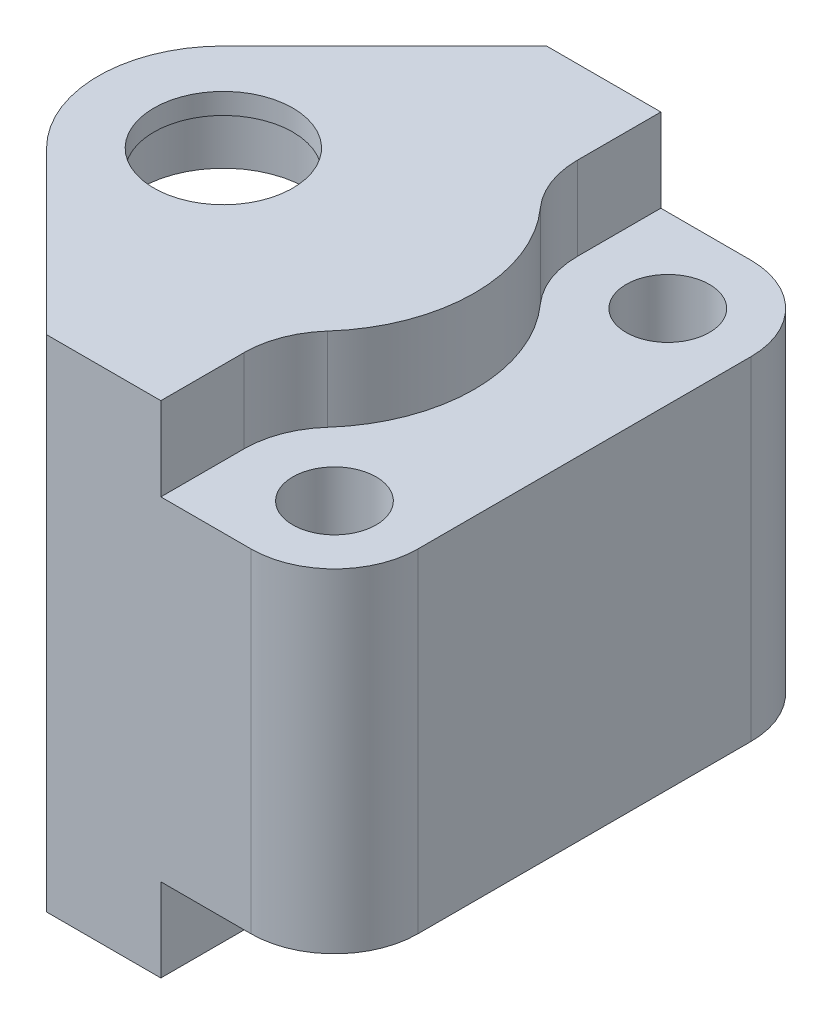
ISO-10303-21;
HEADER;
FILE_DESCRIPTION(('STEP AP214'),'2;1');
FILE_NAME('part.step','',(''),(''),'','','');
FILE_SCHEMA(('AUTOMOTIVE_DESIGN { 1 0 10303 214 1 1 1 1 }'));
ENDSEC;
DATA;
#1=APPLICATION_CONTEXT('core data for automotive mechanical design processes');
#2=APPLICATION_PROTOCOL_DEFINITION('international standard','automotive_design',2000,#1);
#3=PRODUCT_CONTEXT('',#1,'mechanical');
#4=PRODUCT('Part','Part','',(#3));
#5=PRODUCT_RELATED_PRODUCT_CATEGORY('part','',(#4));
#6=PRODUCT_DEFINITION_FORMATION('','',#4);
#7=PRODUCT_DEFINITION_CONTEXT('part definition',#1,'design');
#8=PRODUCT_DEFINITION('design','',#6,#7);
#9=PRODUCT_DEFINITION_SHAPE('','',#8);
#10=(LENGTH_UNIT() NAMED_UNIT(*) SI_UNIT(.MILLI.,.METRE.));
#11=(NAMED_UNIT(*) PLANE_ANGLE_UNIT() SI_UNIT($,.RADIAN.));
#12=(NAMED_UNIT(*) SI_UNIT($,.STERADIAN.) SOLID_ANGLE_UNIT());
#13=UNCERTAINTY_MEASURE_WITH_UNIT(LENGTH_MEASURE(1.E-05),#10,'distance_accuracy_value','');
#14=(GEOMETRIC_REPRESENTATION_CONTEXT(3) GLOBAL_UNCERTAINTY_ASSIGNED_CONTEXT((#13)) GLOBAL_UNIT_ASSIGNED_CONTEXT((#10,
#11,#12)) REPRESENTATION_CONTEXT('',''));
#15=CARTESIAN_POINT('',(0.,0.,0.));
#16=DIRECTION('',(0.,0.,1.));
#17=DIRECTION('',(1.,0.,0.));
#18=AXIS2_PLACEMENT_3D('',#15,#16,#17);
#19=CARTESIAN_POINT('',(13.,9.,-6.));
#20=DIRECTION('',(-1.,0.,0.));
#21=DIRECTION('',(0.,0.,1.));
#22=AXIS2_PLACEMENT_3D('',#19,#20,#21);
#23=PLANE('',#22);
#24=DIRECTION('',(0.,0.,1.));
#25=VECTOR('',#24,1.);
#26=CARTESIAN_POINT('',(13.,-6.,0.));
#27=LINE('',#26,#25);
#28=CARTESIAN_POINT('',(13.,-6.,-6.));
#29=VERTEX_POINT('',#28);
#30=CARTESIAN_POINT('',(13.,-6.,6.));
#31=VERTEX_POINT('',#30);
#32=EDGE_CURVE('E266',#29,#31,#27,.T.);
#33=ORIENTED_EDGE('',*,*,#32,.F.);
#34=DIRECTION('',(0.,-1.,0.));
#35=VECTOR('',#34,1.);
#36=CARTESIAN_POINT('',(13.,9.,-6.));
#37=LINE('',#36,#35);
#38=CARTESIAN_POINT('',(13.,6.,-6.));
#39=VERTEX_POINT('',#38);
#40=EDGE_CURVE('E479',#39,#29,#37,.T.);
#41=ORIENTED_EDGE('',*,*,#40,.F.);
#42=DIRECTION('',(0.,0.,-1.));
#43=VECTOR('',#42,1.);
#44=CARTESIAN_POINT('',(13.,6.,0.));
#45=LINE('',#44,#43);
#46=CARTESIAN_POINT('',(13.,6.,6.));
#47=VERTEX_POINT('',#46);
#48=EDGE_CURVE('E318',#47,#39,#45,.T.);
#49=ORIENTED_EDGE('',*,*,#48,.F.);
#50=DIRECTION('',(0.,-1.,0.));
#51=VECTOR('',#50,1.);
#52=CARTESIAN_POINT('',(13.,9.,6.));
#53=LINE('',#52,#51);
#54=EDGE_CURVE('E485',#47,#31,#53,.T.);
#55=ORIENTED_EDGE('',*,*,#54,.T.);
#56=EDGE_LOOP('',(#33,#41,#49,#55));
#57=FACE_BOUND('',#56,.T.);
#58=ADVANCED_FACE('F48',(#57),#23,.F.);
#59=CARTESIAN_POINT('',(2.63603896932105,9.,9.));
#60=DIRECTION('',(0.,0.,-1.));
#61=DIRECTION('',(-1.,0.,0.));
#62=AXIS2_PLACEMENT_3D('',#59,#60,#61);
#63=PLANE('',#62);
#64=DIRECTION('',(-1.,0.,0.));
#65=VECTOR('',#64,1.);
#66=CARTESIAN_POINT('',(0.,-6.,9.));
#67=LINE('',#66,#65);
#68=CARTESIAN_POINT('',(10.,-6.,9.));
#69=VERTEX_POINT('',#68);
#70=CARTESIAN_POINT('',(6.75,-6.,9.));
#71=VERTEX_POINT('',#70);
#72=EDGE_CURVE('E259',#69,#71,#67,.T.);
#73=ORIENTED_EDGE('',*,*,#72,.F.);
#74=DIRECTION('',(0.,-1.,0.));
#75=VECTOR('',#74,1.);
#76=CARTESIAN_POINT('',(10.,9.,9.));
#77=LINE('',#76,#75);
#78=CARTESIAN_POINT('',(10.,6.,9.));
#79=VERTEX_POINT('',#78);
#80=EDGE_CURVE('E484',#79,#69,#77,.T.);
#81=ORIENTED_EDGE('',*,*,#80,.F.);
#82=DIRECTION('',(1.,0.,0.));
#83=VECTOR('',#82,1.);
#84=CARTESIAN_POINT('',(0.,6.,9.));
#85=LINE('',#84,#83);
#86=CARTESIAN_POINT('',(6.75,6.,9.));
#87=VERTEX_POINT('',#86);
#88=EDGE_CURVE('E323',#87,#79,#85,.T.);
#89=ORIENTED_EDGE('',*,*,#88,.F.);
#90=DIRECTION('',(0.,1.,0.));
#91=VECTOR('',#90,1.);
#92=CARTESIAN_POINT('',(6.75,6.,9.));
#93=LINE('',#92,#91);
#94=CARTESIAN_POINT('',(6.75,9.,9.));
#95=VERTEX_POINT('',#94);
#96=EDGE_CURVE('E336',#87,#95,#93,.T.);
#97=ORIENTED_EDGE('',*,*,#96,.T.);
#98=DIRECTION('',(1.,0.,0.));
#99=VECTOR('',#98,1.);
#100=CARTESIAN_POINT('',(2.63603896932105,9.,9.));
#101=LINE('',#100,#99);
#102=CARTESIAN_POINT('',(2.63603896932105,9.,9.));
#103=VERTEX_POINT('',#102);
#104=EDGE_CURVE('E444',#103,#95,#101,.T.);
#105=ORIENTED_EDGE('',*,*,#104,.F.);
#106=DIRECTION('',(0.,-1.,0.));
#107=VECTOR('',#106,1.);
#108=CARTESIAN_POINT('',(2.63603896932105,9.,9.));
#109=LINE('',#108,#107);
#110=CARTESIAN_POINT('',(2.63603896932105,6.25,9.));
#111=VERTEX_POINT('',#110);
#112=EDGE_CURVE('E487',#103,#111,#109,.T.);
#113=ORIENTED_EDGE('',*,*,#112,.T.);
#114=DIRECTION('',(0.,-1.,0.));
#115=VECTOR('',#114,1.);
#116=CARTESIAN_POINT('',(2.63603896932105,6.25,9.));
#117=LINE('',#116,#115);
#118=CARTESIAN_POINT('',(2.63603896932105,-6.25,9.));
#119=VERTEX_POINT('',#118);
#120=EDGE_CURVE('E425',#111,#119,#117,.T.);
#121=ORIENTED_EDGE('',*,*,#120,.T.);
#122=CARTESIAN_POINT('',(2.63603896932105,-9.,9.));
#123=VERTEX_POINT('',#122);
#124=EDGE_CURVE('E488',#119,#123,#109,.T.);
#125=ORIENTED_EDGE('',*,*,#124,.T.);
#126=DIRECTION('',(1.,0.,0.));
#127=VECTOR('',#126,1.);
#128=CARTESIAN_POINT('',(2.63603896932105,-9.,9.));
#129=LINE('',#128,#127);
#130=CARTESIAN_POINT('',(6.75,-9.,9.));
#131=VERTEX_POINT('',#130);
#132=EDGE_CURVE('E456',#123,#131,#129,.T.);
#133=ORIENTED_EDGE('',*,*,#132,.T.);
#134=DIRECTION('',(0.,-1.,0.));
#135=VECTOR('',#134,1.);
#136=CARTESIAN_POINT('',(6.75,-6.,9.));
#137=LINE('',#136,#135);
#138=EDGE_CURVE('E291',#71,#131,#137,.T.);
#139=ORIENTED_EDGE('',*,*,#138,.F.);
#140=EDGE_LOOP('',(#73,#81,#89,#97,#105,#113,#121,#125,#133,#139));
#141=FACE_BOUND('',#140,.T.);
#142=ADVANCED_FACE('F518',(#141),#63,.F.);
#143=CARTESIAN_POINT('',(10.,9.,6.));
#144=DIRECTION('',(0.,-1.,0.));
#145=DIRECTION('',(0.,0.,-1.));
#146=AXIS2_PLACEMENT_3D('',#143,#144,#145);
#147=CYLINDRICAL_SURFACE('',#146,3.);
#148=CARTESIAN_POINT('',(10.,-6.,6.));
#149=DIRECTION('',(0.,-1.,0.));
#150=DIRECTION('',(0.,0.,-1.));
#151=AXIS2_PLACEMENT_3D('',#148,#149,#150);
#152=CIRCLE('',#151,3.);
#153=EDGE_CURVE('E262',#31,#69,#152,.T.);
#154=ORIENTED_EDGE('',*,*,#153,.F.);
#155=ORIENTED_EDGE('',*,*,#54,.F.);
#156=CARTESIAN_POINT('',(10.,6.,6.));
#157=DIRECTION('',(0.,-1.,0.));
#158=DIRECTION('',(0.,0.,-1.));
#159=AXIS2_PLACEMENT_3D('',#156,#157,#158);
#160=CIRCLE('',#159,3.);
#161=EDGE_CURVE('E319',#47,#79,#160,.T.);
#162=ORIENTED_EDGE('',*,*,#161,.T.);
#163=ORIENTED_EDGE('',*,*,#80,.T.);
#164=EDGE_LOOP('',(#154,#155,#162,#163));
#165=FACE_BOUND('',#164,.T.);
#166=ADVANCED_FACE('F524',(#165),#147,.T.);
#167=CARTESIAN_POINT('',(10.,9.,-6.));
#168=DIRECTION('',(0.,-1.,0.));
#169=DIRECTION('',(0.,0.,-1.));
#170=AXIS2_PLACEMENT_3D('',#167,#168,#169);
#171=CYLINDRICAL_SURFACE('',#170,3.);
#172=CARTESIAN_POINT('',(10.,-6.,-6.));
#173=DIRECTION('',(0.,-1.,0.));
#174=DIRECTION('',(0.,0.,-1.));
#175=AXIS2_PLACEMENT_3D('',#172,#173,#174);
#176=CIRCLE('',#175,3.);
#177=CARTESIAN_POINT('',(10.,-6.,-9.));
#178=VERTEX_POINT('',#177);
#179=EDGE_CURVE('E268',#178,#29,#176,.T.);
#180=ORIENTED_EDGE('',*,*,#179,.F.);
#181=DIRECTION('',(0.,-1.,0.));
#182=VECTOR('',#181,1.);
#183=CARTESIAN_POINT('',(10.,9.,-9.));
#184=LINE('',#183,#182);
#185=CARTESIAN_POINT('',(10.,6.,-9.));
#186=VERTEX_POINT('',#185);
#187=EDGE_CURVE('E478',#186,#178,#184,.T.);
#188=ORIENTED_EDGE('',*,*,#187,.F.);
#189=CARTESIAN_POINT('',(10.,6.,-6.));
#190=DIRECTION('',(0.,-1.,0.));
#191=DIRECTION('',(0.,0.,-1.));
#192=AXIS2_PLACEMENT_3D('',#189,#190,#191);
#193=CIRCLE('',#192,3.);
#194=EDGE_CURVE('E312',#186,#39,#193,.T.);
#195=ORIENTED_EDGE('',*,*,#194,.T.);
#196=ORIENTED_EDGE('',*,*,#40,.T.);
#197=EDGE_LOOP('',(#180,#188,#195,#196));
#198=FACE_BOUND('',#197,.T.);
#199=ADVANCED_FACE('F533',(#198),#171,.T.);
#200=CARTESIAN_POINT('',(10.,9.,-6.));
#201=DIRECTION('',(0.,-1.,0.));
#202=DIRECTION('',(0.,0.,-1.));
#203=AXIS2_PLACEMENT_3D('',#200,#201,#202);
#204=CYLINDRICAL_SURFACE('',#203,1.5);
#205=CARTESIAN_POINT('',(10.,6.,-6.));
#206=DIRECTION('',(0.,-1.,0.));
#207=DIRECTION('',(0.,0.,-1.));
#208=AXIS2_PLACEMENT_3D('',#205,#206,#207);
#209=CIRCLE('',#208,1.5);
#210=CARTESIAN_POINT('',(10.,6.,-7.5));
#211=VERTEX_POINT('',#210);
#212=EDGE_CURVE('E355',#211,#211,#209,.T.);
#213=ORIENTED_EDGE('',*,*,#212,.F.);
#214=EDGE_LOOP('',(#213));
#215=FACE_BOUND('',#214,.T.);
#216=CARTESIAN_POINT('',(10.,-6.,-6.));
#217=DIRECTION('',(0.,-1.,0.));
#218=DIRECTION('',(0.,0.,-1.));
#219=AXIS2_PLACEMENT_3D('',#216,#217,#218);
#220=CIRCLE('',#219,1.5);
#221=CARTESIAN_POINT('',(10.,-6.,-7.5));
#222=VERTEX_POINT('',#221);
#223=EDGE_CURVE('E300',#222,#222,#220,.T.);
#224=ORIENTED_EDGE('',*,*,#223,.T.);
#225=EDGE_LOOP('',(#224));
#226=FACE_BOUND('',#225,.T.);
#227=ADVANCED_FACE('F502',(#215,#226),#204,.F.);
#228=CARTESIAN_POINT('',(10.,9.,6.));
#229=DIRECTION('',(0.,-1.,0.));
#230=DIRECTION('',(0.,0.,-1.));
#231=AXIS2_PLACEMENT_3D('',#228,#229,#230);
#232=CYLINDRICAL_SURFACE('',#231,1.5);
#233=CARTESIAN_POINT('',(10.,6.,6.));
#234=DIRECTION('',(0.,-1.,0.));
#235=DIRECTION('',(0.,0.,-1.));
#236=AXIS2_PLACEMENT_3D('',#233,#234,#235);
#237=CIRCLE('',#236,1.5);
#238=CARTESIAN_POINT('',(10.,6.,4.5));
#239=VERTEX_POINT('',#238);
#240=EDGE_CURVE('E352',#239,#239,#237,.T.);
#241=ORIENTED_EDGE('',*,*,#240,.F.);
#242=EDGE_LOOP('',(#241));
#243=FACE_BOUND('',#242,.T.);
#244=CARTESIAN_POINT('',(10.,-6.,6.));
#245=DIRECTION('',(0.,-1.,0.));
#246=DIRECTION('',(0.,0.,-1.));
#247=AXIS2_PLACEMENT_3D('',#244,#245,#246);
#248=CIRCLE('',#247,1.5);
#249=CARTESIAN_POINT('',(10.,-6.,4.5));
#250=VERTEX_POINT('',#249);
#251=EDGE_CURVE('E55',#250,#250,#248,.T.);
#252=ORIENTED_EDGE('',*,*,#251,.T.);
#253=EDGE_LOOP('',(#252));
#254=FACE_BOUND('',#253,.T.);
#255=ADVANCED_FACE('F500',(#243,#254),#232,.F.);
#256=CARTESIAN_POINT('',(2.63603896932105,9.,-9.));
#257=DIRECTION('',(0.,0.,1.));
#258=DIRECTION('',(1.,0.,0.));
#259=AXIS2_PLACEMENT_3D('',#256,#257,#258);
#260=PLANE('',#259);
#261=DIRECTION('',(1.,0.,0.));
#262=VECTOR('',#261,1.);
#263=CARTESIAN_POINT('',(0.,-6.,-9.00000000000001));
#264=LINE('',#263,#262);
#265=CARTESIAN_POINT('',(6.75,-6.,-9.));
#266=VERTEX_POINT('',#265);
#267=EDGE_CURVE('E269',#266,#178,#264,.T.);
#268=ORIENTED_EDGE('',*,*,#267,.F.);
#269=DIRECTION('',(0.,-1.,0.));
#270=VECTOR('',#269,1.);
#271=CARTESIAN_POINT('',(6.75,-6.,-9.));
#272=LINE('',#271,#270);
#273=CARTESIAN_POINT('',(6.75,-9.,-9.));
#274=VERTEX_POINT('',#273);
#275=EDGE_CURVE('E289',#266,#274,#272,.T.);
#276=ORIENTED_EDGE('',*,*,#275,.T.);
#277=DIRECTION('',(-1.,0.,0.));
#278=VECTOR('',#277,1.);
#279=CARTESIAN_POINT('',(2.63603896932105,-9.,-9.));
#280=LINE('',#279,#278);
#281=CARTESIAN_POINT('',(2.63603896932105,-9.,-9.));
#282=VERTEX_POINT('',#281);
#283=EDGE_CURVE('E465',#274,#282,#280,.T.);
#284=ORIENTED_EDGE('',*,*,#283,.T.);
#285=DIRECTION('',(0.,-1.,0.));
#286=VECTOR('',#285,1.);
#287=CARTESIAN_POINT('',(2.63603896932105,9.,-9.));
#288=LINE('',#287,#286);
#289=CARTESIAN_POINT('',(2.63603896932105,-6.25,-9.));
#290=VERTEX_POINT('',#289);
#291=EDGE_CURVE('E472',#290,#282,#288,.T.);
#292=ORIENTED_EDGE('',*,*,#291,.F.);
#293=DIRECTION('',(0.,-1.,0.));
#294=VECTOR('',#293,1.);
#295=CARTESIAN_POINT('',(2.63603896932105,6.25,-9.));
#296=LINE('',#295,#294);
#297=CARTESIAN_POINT('',(2.63603896932105,6.25,-9.));
#298=VERTEX_POINT('',#297);
#299=EDGE_CURVE('E426',#298,#290,#296,.T.);
#300=ORIENTED_EDGE('',*,*,#299,.F.);
#301=CARTESIAN_POINT('',(2.63603896932105,9.,-9.));
#302=VERTEX_POINT('',#301);
#303=EDGE_CURVE('E471',#302,#298,#288,.T.);
#304=ORIENTED_EDGE('',*,*,#303,.F.);
#305=DIRECTION('',(-1.,0.,0.));
#306=VECTOR('',#305,1.);
#307=CARTESIAN_POINT('',(2.63603896932105,9.,-9.));
#308=LINE('',#307,#306);
#309=CARTESIAN_POINT('',(6.75,9.,-9.));
#310=VERTEX_POINT('',#309);
#311=EDGE_CURVE('E447',#310,#302,#308,.T.);
#312=ORIENTED_EDGE('',*,*,#311,.F.);
#313=DIRECTION('',(0.,1.,0.));
#314=VECTOR('',#313,1.);
#315=CARTESIAN_POINT('',(6.75,6.,-9.));
#316=LINE('',#315,#314);
#317=CARTESIAN_POINT('',(6.75,6.,-9.));
#318=VERTEX_POINT('',#317);
#319=EDGE_CURVE('E341',#318,#310,#316,.T.);
#320=ORIENTED_EDGE('',*,*,#319,.F.);
#321=DIRECTION('',(-1.,0.,0.));
#322=VECTOR('',#321,1.);
#323=CARTESIAN_POINT('',(0.,6.,-9.00000000000001));
#324=LINE('',#323,#322);
#325=EDGE_CURVE('E315',#186,#318,#324,.T.);
#326=ORIENTED_EDGE('',*,*,#325,.F.);
#327=ORIENTED_EDGE('',*,*,#187,.T.);
#328=EDGE_LOOP('',(#268,#276,#284,#292,#300,#304,#312,#320,#326,#327));
#329=FACE_BOUND('',#328,.T.);
#330=ADVANCED_FACE('F498',(#329),#260,.F.);
#331=CARTESIAN_POINT('',(-3.18198051533947,9.,3.18198051533946));
#332=DIRECTION('',(0.707106781186549,0.,-0.707106781186546));
#333=DIRECTION('',(-0.707106781186546,0.,-0.707106781186549));
#334=AXIS2_PLACEMENT_3D('',#331,#332,#333);
#335=PLANE('',#334);
#336=DIRECTION('',(0.707106781186546,0.,0.707106781186549));
#337=VECTOR('',#336,1.);
#338=CARTESIAN_POINT('',(-3.18198051533947,-6.25,3.18198051533946));
#339=LINE('',#338,#337);
#340=CARTESIAN_POINT('',(-3.18198051533947,-6.25,3.18198051533946));
#341=VERTEX_POINT('',#340);
#342=EDGE_CURVE('E414',#341,#119,#339,.T.);
#343=ORIENTED_EDGE('',*,*,#342,.F.);
#344=DIRECTION('',(0.,-1.,0.));
#345=VECTOR('',#344,1.);
#346=CARTESIAN_POINT('',(-3.18198051533947,9.,3.18198051533946));
#347=LINE('',#346,#345);
#348=CARTESIAN_POINT('',(-3.18198051533947,-9.,3.18198051533946));
#349=VERTEX_POINT('',#348);
#350=EDGE_CURVE('E59',#341,#349,#347,.T.);
#351=ORIENTED_EDGE('',*,*,#350,.T.);
#352=DIRECTION('',(0.707106781186546,0.,0.707106781186549));
#353=VECTOR('',#352,1.);
#354=CARTESIAN_POINT('',(-3.18198051533947,-9.,3.18198051533946));
#355=LINE('',#354,#353);
#356=EDGE_CURVE('E452',#349,#123,#355,.T.);
#357=ORIENTED_EDGE('',*,*,#356,.T.);
#358=ORIENTED_EDGE('',*,*,#124,.F.);
#359=EDGE_LOOP('',(#343,#351,#357,#358));
#360=FACE_BOUND('',#359,.T.);
#361=ADVANCED_FACE('F537',(#360),#335,.F.);
#362=CARTESIAN_POINT('',(-3.18198051533947,9.,-3.18198051533946));
#363=DIRECTION('',(0.707106781186549,0.,0.707106781186546));
#364=DIRECTION('',(0.707106781186546,0.,-0.707106781186549));
#365=AXIS2_PLACEMENT_3D('',#362,#363,#364);
#366=PLANE('',#365);
#367=DIRECTION('',(-0.707106781186546,0.,0.707106781186549));
#368=VECTOR('',#367,1.);
#369=CARTESIAN_POINT('',(2.63603896932105,-6.25,-9.));
#370=LINE('',#369,#368);
#371=CARTESIAN_POINT('',(-3.18198051533947,-6.25,-3.18198051533946));
#372=VERTEX_POINT('',#371);
#373=EDGE_CURVE('E406',#290,#372,#370,.T.);
#374=ORIENTED_EDGE('',*,*,#373,.F.);
#375=ORIENTED_EDGE('',*,*,#291,.T.);
#376=DIRECTION('',(-0.707106781186546,0.,0.707106781186549));
#377=VECTOR('',#376,1.);
#378=CARTESIAN_POINT('',(-3.18198051533947,-9.,-3.18198051533946));
#379=LINE('',#378,#377);
#380=CARTESIAN_POINT('',(-3.18198051533947,-9.,-3.18198051533946));
#381=VERTEX_POINT('',#380);
#382=EDGE_CURVE('E439',#282,#381,#379,.T.);
#383=ORIENTED_EDGE('',*,*,#382,.T.);
#384=DIRECTION('',(0.,-1.,0.));
#385=VECTOR('',#384,1.);
#386=CARTESIAN_POINT('',(-3.18198051533947,9.,-3.18198051533946));
#387=LINE('',#386,#385);
#388=EDGE_CURVE('E453',#372,#381,#387,.T.);
#389=ORIENTED_EDGE('',*,*,#388,.F.);
#390=EDGE_LOOP('',(#374,#375,#383,#389));
#391=FACE_BOUND('',#390,.T.);
#392=ADVANCED_FACE('F546',(#391),#366,.F.);
#393=CARTESIAN_POINT('',(0.,9.,0.));
#394=DIRECTION('',(0.,-1.,0.));
#395=DIRECTION('',(0.,0.,-1.));
#396=AXIS2_PLACEMENT_3D('',#393,#394,#395);
#397=CYLINDRICAL_SURFACE('',#396,4.5);
#398=CARTESIAN_POINT('',(0.,-6.25,0.));
#399=DIRECTION('',(0.,1.,0.));
#400=DIRECTION('',(0.,0.,1.));
#401=AXIS2_PLACEMENT_3D('',#398,#399,#400);
#402=CIRCLE('',#401,4.5);
#403=EDGE_CURVE('E411',#372,#341,#402,.T.);
#404=ORIENTED_EDGE('',*,*,#403,.F.);
#405=ORIENTED_EDGE('',*,*,#388,.T.);
#406=CARTESIAN_POINT('',(0.,-9.,0.));
#407=DIRECTION('',(0.,1.,0.));
#408=DIRECTION('',(0.,0.,-1.));
#409=AXIS2_PLACEMENT_3D('',#406,#407,#408);
#410=CIRCLE('',#409,4.5);
#411=EDGE_CURVE('E432',#381,#349,#410,.T.);
#412=ORIENTED_EDGE('',*,*,#411,.T.);
#413=ORIENTED_EDGE('',*,*,#350,.F.);
#414=EDGE_LOOP('',(#404,#405,#412,#413));
#415=FACE_BOUND('',#414,.T.);
#416=ADVANCED_FACE('F549',(#415),#397,.T.);
#417=CARTESIAN_POINT('',(0.,9.,0.));
#418=DIRECTION('',(0.,-1.,0.));
#419=DIRECTION('',(0.,0.,-1.));
#420=AXIS2_PLACEMENT_3D('',#417,#418,#419);
#421=PLANE('',#420);
#422=DIRECTION('',(0.,0.,1.));
#423=VECTOR('',#422,1.);
#424=CARTESIAN_POINT('',(6.75,9.,0.));
#425=LINE('',#424,#423);
#426=CARTESIAN_POINT('',(6.75,9.,-6.));
#427=VERTEX_POINT('',#426);
#428=EDGE_CURVE('E74',#310,#427,#425,.T.);
#429=ORIENTED_EDGE('',*,*,#428,.F.);
#430=ORIENTED_EDGE('',*,*,#311,.T.);
#431=DIRECTION('',(-0.707106781186546,0.,0.707106781186549));
#432=VECTOR('',#431,1.);
#433=CARTESIAN_POINT('',(-3.18198051533947,9.,-3.18198051533946));
#434=LINE('',#433,#432);
#435=CARTESIAN_POINT('',(-3.18198051533947,9.,-3.18198051533946));
#436=VERTEX_POINT('',#435);
#437=EDGE_CURVE('E448',#302,#436,#434,.T.);
#438=ORIENTED_EDGE('',*,*,#437,.T.);
#439=CARTESIAN_POINT('',(0.,9.,0.));
#440=DIRECTION('',(0.,1.,0.));
#441=DIRECTION('',(0.,0.,-1.));
#442=AXIS2_PLACEMENT_3D('',#439,#440,#441);
#443=CIRCLE('',#442,4.5);
#444=CARTESIAN_POINT('',(-3.18198051533947,9.,3.18198051533946));
#445=VERTEX_POINT('',#444);
#446=EDGE_CURVE('E434',#436,#445,#443,.T.);
#447=ORIENTED_EDGE('',*,*,#446,.T.);
#448=DIRECTION('',(0.707106781186546,0.,0.707106781186549));
#449=VECTOR('',#448,1.);
#450=CARTESIAN_POINT('',(-3.18198051533947,9.,3.18198051533946));
#451=LINE('',#450,#449);
#452=EDGE_CURVE('E438',#445,#103,#451,.T.);
#453=ORIENTED_EDGE('',*,*,#452,.T.);
#454=ORIENTED_EDGE('',*,*,#104,.T.);
#455=DIRECTION('',(0.,0.,1.));
#456=VECTOR('',#455,1.);
#457=CARTESIAN_POINT('',(6.75,9.,0.));
#458=LINE('',#457,#456);
#459=CARTESIAN_POINT('',(6.75,9.,6.));
#460=VERTEX_POINT('',#459);
#461=EDGE_CURVE('E302',#460,#95,#458,.T.);
#462=ORIENTED_EDGE('',*,*,#461,.F.);
#463=CARTESIAN_POINT('',(10.,9.,6.));
#464=DIRECTION('',(0.,-1.,0.));
#465=DIRECTION('',(0.,0.,-1.));
#466=AXIS2_PLACEMENT_3D('',#463,#464,#465);
#467=CIRCLE('',#466,3.25);
#468=CARTESIAN_POINT('',(7.57759302437523,9.,3.83333333333333));
#469=VERTEX_POINT('',#468);
#470=EDGE_CURVE('E296',#460,#469,#467,.T.);
#471=ORIENTED_EDGE('',*,*,#470,.T.);
#472=CARTESIAN_POINT('',(3.29179606750063,9.,0.));
#473=DIRECTION('',(0.,-1.,0.));
#474=DIRECTION('',(0.,0.,-1.));
#475=AXIS2_PLACEMENT_3D('',#472,#473,#474);
#476=CIRCLE('',#475,5.75);
#477=CARTESIAN_POINT('',(7.57759302437523,9.,-3.83333333333333));
#478=VERTEX_POINT('',#477);
#479=EDGE_CURVE('E332',#478,#469,#476,.T.);
#480=ORIENTED_EDGE('',*,*,#479,.F.);
#481=CARTESIAN_POINT('',(10.,9.,-6.));
#482=DIRECTION('',(0.,-1.,0.));
#483=DIRECTION('',(0.,0.,-1.));
#484=AXIS2_PLACEMENT_3D('',#481,#482,#483);
#485=CIRCLE('',#484,3.25);
#486=EDGE_CURVE('E331',#478,#427,#485,.T.);
#487=ORIENTED_EDGE('',*,*,#486,.T.);
#488=EDGE_LOOP('',(#429,#430,#438,#447,#453,#454,#462,#471,#480,#487));
#489=FACE_BOUND('',#488,.T.);
#490=CARTESIAN_POINT('',(0.,9.,0.));
#491=DIRECTION('',(0.,-1.,0.));
#492=DIRECTION('',(0.,0.,-1.));
#493=AXIS2_PLACEMENT_3D('',#490,#491,#492);
#494=CIRCLE('',#493,2.5);
#495=CARTESIAN_POINT('',(0.,9.,-2.5));
#496=VERTEX_POINT('',#495);
#497=EDGE_CURVE('E369',#496,#496,#494,.T.);
#498=ORIENTED_EDGE('',*,*,#497,.T.);
#499=EDGE_LOOP('',(#498));
#500=FACE_BOUND('',#499,.T.);
#501=ADVANCED_FACE('F609',(#489,#500),#421,.F.);
#502=CARTESIAN_POINT('',(0.,-9.,0.));
#503=DIRECTION('',(0.,-1.,0.));
#504=DIRECTION('',(0.,0.,-1.));
#505=AXIS2_PLACEMENT_3D('',#502,#503,#504);
#506=PLANE('',#505);
#507=DIRECTION('',(0.,0.,-1.));
#508=VECTOR('',#507,1.);
#509=CARTESIAN_POINT('',(6.75,-9.,0.));
#510=LINE('',#509,#508);
#511=CARTESIAN_POINT('',(6.75,-9.,-6.));
#512=VERTEX_POINT('',#511);
#513=EDGE_CURVE('E283',#512,#274,#510,.T.);
#514=ORIENTED_EDGE('',*,*,#513,.F.);
#515=CARTESIAN_POINT('',(10.,-9.,-6.));
#516=DIRECTION('',(0.,-1.,0.));
#517=DIRECTION('',(0.,0.,-1.));
#518=AXIS2_PLACEMENT_3D('',#515,#516,#517);
#519=CIRCLE('',#518,3.25);
#520=CARTESIAN_POINT('',(7.57759302437523,-9.,-3.83333333333333));
#521=VERTEX_POINT('',#520);
#522=EDGE_CURVE('E244',#521,#512,#519,.T.);
#523=ORIENTED_EDGE('',*,*,#522,.F.);
#524=CARTESIAN_POINT('',(3.29179606750063,-9.,0.));
#525=DIRECTION('',(0.,-1.,0.));
#526=DIRECTION('',(0.,0.,-1.));
#527=AXIS2_PLACEMENT_3D('',#524,#525,#526);
#528=CIRCLE('',#527,5.75);
#529=CARTESIAN_POINT('',(7.57759302437523,-9.,3.83333333333333));
#530=VERTEX_POINT('',#529);
#531=EDGE_CURVE('E68',#521,#530,#528,.T.);
#532=ORIENTED_EDGE('',*,*,#531,.T.);
#533=CARTESIAN_POINT('',(10.,-9.,6.));
#534=DIRECTION('',(0.,-1.,0.));
#535=DIRECTION('',(0.,0.,-1.));
#536=AXIS2_PLACEMENT_3D('',#533,#534,#535);
#537=CIRCLE('',#536,3.25);
#538=CARTESIAN_POINT('',(6.75,-9.,6.));
#539=VERTEX_POINT('',#538);
#540=EDGE_CURVE('E253',#539,#530,#537,.T.);
#541=ORIENTED_EDGE('',*,*,#540,.F.);
#542=DIRECTION('',(0.,0.,-1.));
#543=VECTOR('',#542,1.);
#544=CARTESIAN_POINT('',(6.75,-9.,0.));
#545=LINE('',#544,#543);
#546=EDGE_CURVE('E276',#131,#539,#545,.T.);
#547=ORIENTED_EDGE('',*,*,#546,.F.);
#548=ORIENTED_EDGE('',*,*,#132,.F.);
#549=ORIENTED_EDGE('',*,*,#356,.F.);
#550=ORIENTED_EDGE('',*,*,#411,.F.);
#551=ORIENTED_EDGE('',*,*,#382,.F.);
#552=ORIENTED_EDGE('',*,*,#283,.F.);
#553=EDGE_LOOP('',(#514,#523,#532,#541,#547,#548,#549,#550,#551,#552));
#554=FACE_BOUND('',#553,.T.);
#555=CARTESIAN_POINT('',(0.,-9.,0.));
#556=DIRECTION('',(0.,-1.,0.));
#557=DIRECTION('',(0.,0.,-1.));
#558=AXIS2_PLACEMENT_3D('',#555,#556,#557);
#559=CIRCLE('',#558,2.5);
#560=CARTESIAN_POINT('',(0.,-9.,-2.5));
#561=VERTEX_POINT('',#560);
#562=EDGE_CURVE('E363',#561,#561,#559,.T.);
#563=ORIENTED_EDGE('',*,*,#562,.F.);
#564=EDGE_LOOP('',(#563));
#565=FACE_BOUND('',#564,.T.);
#566=ADVANCED_FACE('F547',(#554,#565),#506,.T.);
#567=CARTESIAN_POINT('',(-3.18198051533947,6.25,-3.18198051533946));
#568=VERTEX_POINT('',#567);
#569=EDGE_CURVE('E466',#436,#568,#387,.T.);
#570=ORIENTED_EDGE('',*,*,#569,.T.);
#571=CARTESIAN_POINT('',(0.,6.25,0.));
#572=DIRECTION('',(0.,1.,0.));
#573=DIRECTION('',(0.,0.,1.));
#574=AXIS2_PLACEMENT_3D('',#571,#572,#573);
#575=CIRCLE('',#574,4.5);
#576=CARTESIAN_POINT('',(-3.18198051533947,6.25,3.18198051533946));
#577=VERTEX_POINT('',#576);
#578=EDGE_CURVE('E394',#568,#577,#575,.T.);
#579=ORIENTED_EDGE('',*,*,#578,.T.);
#580=EDGE_CURVE('E11',#445,#577,#347,.T.);
#581=ORIENTED_EDGE('',*,*,#580,.F.);
#582=ORIENTED_EDGE('',*,*,#446,.F.);
#583=EDGE_LOOP('',(#570,#579,#581,#582));
#584=FACE_BOUND('',#583,.T.);
#585=ADVANCED_FACE('F49',(#584),#397,.T.);
#586=ORIENTED_EDGE('',*,*,#580,.T.);
#587=DIRECTION('',(0.707106781186546,0.,0.707106781186549));
#588=VECTOR('',#587,1.);
#589=CARTESIAN_POINT('',(-3.18198051533947,6.25,3.18198051533946));
#590=LINE('',#589,#588);
#591=EDGE_CURVE('E396',#577,#111,#590,.T.);
#592=ORIENTED_EDGE('',*,*,#591,.T.);
#593=ORIENTED_EDGE('',*,*,#112,.F.);
#594=ORIENTED_EDGE('',*,*,#452,.F.);
#595=EDGE_LOOP('',(#586,#592,#593,#594));
#596=FACE_BOUND('',#595,.T.);
#597=ADVANCED_FACE('F532',(#596),#335,.F.);
#598=ORIENTED_EDGE('',*,*,#303,.T.);
#599=DIRECTION('',(-0.707106781186546,0.,0.707106781186549));
#600=VECTOR('',#599,1.);
#601=CARTESIAN_POINT('',(2.63603896932105,6.25,-9.));
#602=LINE('',#601,#600);
#603=EDGE_CURVE('E388',#298,#568,#602,.T.);
#604=ORIENTED_EDGE('',*,*,#603,.T.);
#605=ORIENTED_EDGE('',*,*,#569,.F.);
#606=ORIENTED_EDGE('',*,*,#437,.F.);
#607=EDGE_LOOP('',(#598,#604,#605,#606));
#608=FACE_BOUND('',#607,.T.);
#609=ADVANCED_FACE('F540',(#608),#366,.F.);
#610=CARTESIAN_POINT('',(0.,6.25,0.));
#611=DIRECTION('',(0.,-1.,0.));
#612=DIRECTION('',(0.,0.,-1.));
#613=AXIS2_PLACEMENT_3D('',#610,#611,#612);
#614=CYLINDRICAL_SURFACE('',#613,5.25);
#615=CARTESIAN_POINT('',(0.,-6.25,0.));
#616=DIRECTION('',(0.,1.,0.));
#617=DIRECTION('',(0.,0.,-1.));
#618=AXIS2_PLACEMENT_3D('',#615,#616,#617);
#619=CIRCLE('',#618,5.25);
#620=CARTESIAN_POINT('',(5.00096940847824,-6.25,1.59774997276322));
#621=VERTEX_POINT('',#620);
#622=CARTESIAN_POINT('',(5.00096940847824,-6.25,-1.59774997276322));
#623=VERTEX_POINT('',#622);
#624=EDGE_CURVE('E373',#621,#623,#619,.T.);
#625=ORIENTED_EDGE('',*,*,#624,.F.);
#626=DIRECTION('',(0.,-1.,0.));
#627=VECTOR('',#626,1.);
#628=CARTESIAN_POINT('',(5.00096940847824,6.25,1.59774997276322));
#629=LINE('',#628,#627);
#630=CARTESIAN_POINT('',(5.00096940847824,6.25,1.59774997276322));
#631=VERTEX_POINT('',#630);
#632=EDGE_CURVE('E404',#631,#621,#629,.T.);
#633=ORIENTED_EDGE('',*,*,#632,.F.);
#634=CARTESIAN_POINT('',(0.,6.25,0.));
#635=DIRECTION('',(0.,1.,0.));
#636=DIRECTION('',(0.,0.,-1.));
#637=AXIS2_PLACEMENT_3D('',#634,#635,#636);
#638=CIRCLE('',#637,5.25);
#639=CARTESIAN_POINT('',(5.00096940847824,6.25,-1.59774997276322));
#640=VERTEX_POINT('',#639);
#641=EDGE_CURVE('E383',#631,#640,#638,.T.);
#642=ORIENTED_EDGE('',*,*,#641,.T.);
#643=DIRECTION('',(0.,-1.,0.));
#644=VECTOR('',#643,1.);
#645=CARTESIAN_POINT('',(5.00096940847824,6.25,-1.59774997276322));
#646=LINE('',#645,#644);
#647=EDGE_CURVE('E429',#640,#623,#646,.T.);
#648=ORIENTED_EDGE('',*,*,#647,.T.);
#649=EDGE_LOOP('',(#625,#633,#642,#648));
#650=FACE_BOUND('',#649,.T.);
#651=ADVANCED_FACE('F543',(#650),#614,.F.);
#652=CARTESIAN_POINT('',(5.00096940847824,6.25,-1.59774997276322));
#653=DIRECTION('',(-0.952565601614902,0.,0.304333328145375));
#654=DIRECTION('',(0.304333328145375,0.,0.952565601614902));
#655=AXIS2_PLACEMENT_3D('',#652,#653,#654);
#656=PLANE('',#655);
#657=DIRECTION('',(-0.304333328145375,0.,-0.952565601614902));
#658=VECTOR('',#657,1.);
#659=CARTESIAN_POINT('',(5.00096940847824,-6.25,-1.59774997276322));
#660=LINE('',#659,#658);
#661=EDGE_CURVE('E410',#623,#290,#660,.T.);
#662=ORIENTED_EDGE('',*,*,#661,.F.);
#663=ORIENTED_EDGE('',*,*,#647,.F.);
#664=DIRECTION('',(-0.304333328145375,0.,-0.952565601614902));
#665=VECTOR('',#664,1.);
#666=CARTESIAN_POINT('',(5.00096940847824,6.25,-1.59774997276322));
#667=LINE('',#666,#665);
#668=EDGE_CURVE('E390',#640,#298,#667,.T.);
#669=ORIENTED_EDGE('',*,*,#668,.T.);
#670=ORIENTED_EDGE('',*,*,#299,.T.);
#671=EDGE_LOOP('',(#662,#663,#669,#670));
#672=FACE_BOUND('',#671,.T.);
#673=ADVANCED_FACE('F627',(#672),#656,.T.);
#674=CARTESIAN_POINT('',(2.63603896932105,6.25,9.));
#675=DIRECTION('',(-0.952565601614902,0.,-0.304333328145375));
#676=DIRECTION('',(-0.304333328145375,0.,0.952565601614902));
#677=AXIS2_PLACEMENT_3D('',#674,#675,#676);
#678=PLANE('',#677);
#679=DIRECTION('',(0.304333328145375,0.,-0.952565601614902));
#680=VECTOR('',#679,1.);
#681=CARTESIAN_POINT('',(2.63603896932105,-6.25,9.));
#682=LINE('',#681,#680);
#683=EDGE_CURVE('E389',#119,#621,#682,.T.);
#684=ORIENTED_EDGE('',*,*,#683,.F.);
#685=ORIENTED_EDGE('',*,*,#120,.F.);
#686=DIRECTION('',(0.304333328145375,0.,-0.952565601614902));
#687=VECTOR('',#686,1.);
#688=CARTESIAN_POINT('',(2.63603896932105,6.25,9.));
#689=LINE('',#688,#687);
#690=EDGE_CURVE('E405',#111,#631,#689,.T.);
#691=ORIENTED_EDGE('',*,*,#690,.T.);
#692=ORIENTED_EDGE('',*,*,#632,.T.);
#693=EDGE_LOOP('',(#684,#685,#691,#692));
#694=FACE_BOUND('',#693,.T.);
#695=ADVANCED_FACE('F629',(#694),#678,.T.);
#696=CARTESIAN_POINT('',(0.,6.25,0.));
#697=DIRECTION('',(0.,-1.,0.));
#698=DIRECTION('',(0.,0.,-1.));
#699=AXIS2_PLACEMENT_3D('',#696,#697,#698);
#700=PLANE('',#699);
#701=CARTESIAN_POINT('',(0.,6.25,0.));
#702=DIRECTION('',(0.,-1.,0.));
#703=DIRECTION('',(0.,0.,-1.));
#704=AXIS2_PLACEMENT_3D('',#701,#702,#703);
#705=CIRCLE('',#704,3.);
#706=CARTESIAN_POINT('',(0.,6.25,-3.));
#707=VERTEX_POINT('',#706);
#708=EDGE_CURVE('E358',#707,#707,#705,.T.);
#709=ORIENTED_EDGE('',*,*,#708,.F.);
#710=EDGE_LOOP('',(#709));
#711=FACE_BOUND('',#710,.T.);
#712=ORIENTED_EDGE('',*,*,#641,.F.);
#713=ORIENTED_EDGE('',*,*,#690,.F.);
#714=ORIENTED_EDGE('',*,*,#591,.F.);
#715=ORIENTED_EDGE('',*,*,#578,.F.);
#716=ORIENTED_EDGE('',*,*,#603,.F.);
#717=ORIENTED_EDGE('',*,*,#668,.F.);
#718=EDGE_LOOP('',(#712,#713,#714,#715,#716,#717));
#719=FACE_BOUND('',#718,.T.);
#720=ADVANCED_FACE('F618',(#711,#719),#700,.T.);
#721=CARTESIAN_POINT('',(0.,-6.25,0.));
#722=DIRECTION('',(0.,-1.,0.));
#723=DIRECTION('',(0.,0.,-1.));
#724=AXIS2_PLACEMENT_3D('',#721,#722,#723);
#725=PLANE('',#724);
#726=CARTESIAN_POINT('',(0.,-6.25,0.));
#727=DIRECTION('',(0.,-1.,0.));
#728=DIRECTION('',(0.,0.,-1.));
#729=AXIS2_PLACEMENT_3D('',#726,#727,#728);
#730=CIRCLE('',#729,3.);
#731=CARTESIAN_POINT('',(0.,-6.25,-3.));
#732=VERTEX_POINT('',#731);
#733=EDGE_CURVE('E351',#732,#732,#730,.T.);
#734=ORIENTED_EDGE('',*,*,#733,.T.);
#735=EDGE_LOOP('',(#734));
#736=FACE_BOUND('',#735,.T.);
#737=ORIENTED_EDGE('',*,*,#624,.T.);
#738=ORIENTED_EDGE('',*,*,#661,.T.);
#739=ORIENTED_EDGE('',*,*,#373,.T.);
#740=ORIENTED_EDGE('',*,*,#403,.T.);
#741=ORIENTED_EDGE('',*,*,#342,.T.);
#742=ORIENTED_EDGE('',*,*,#683,.T.);
#743=EDGE_LOOP('',(#737,#738,#739,#740,#741,#742));
#744=FACE_BOUND('',#743,.T.);
#745=ADVANCED_FACE('F630',(#736,#744),#725,.F.);
#746=CARTESIAN_POINT('',(0.,-11.5038439249527,0.));
#747=DIRECTION('',(0.,-1.,0.));
#748=DIRECTION('',(0.,0.,-1.));
#749=AXIS2_PLACEMENT_3D('',#746,#747,#748);
#750=CYLINDRICAL_SURFACE('',#749,2.5);
#751=ORIENTED_EDGE('',*,*,#562,.T.);
#752=EDGE_LOOP('',(#751));
#753=FACE_BOUND('',#752,.T.);
#754=CARTESIAN_POINT('',(0.,-8.25,0.));
#755=DIRECTION('',(0.,-1.,0.));
#756=DIRECTION('',(0.,0.,-1.));
#757=AXIS2_PLACEMENT_3D('',#754,#755,#756);
#758=CIRCLE('',#757,2.5);
#759=CARTESIAN_POINT('',(0.,-8.25,-2.5));
#760=VERTEX_POINT('',#759);
#761=EDGE_CURVE('E377',#760,#760,#758,.T.);
#762=ORIENTED_EDGE('',*,*,#761,.F.);
#763=EDGE_LOOP('',(#762));
#764=FACE_BOUND('',#763,.T.);
#765=ADVANCED_FACE('F835',(#753,#764),#750,.F.);
#766=CARTESIAN_POINT('',(-2.5,-8.25,0.));
#767=DIRECTION('',(0.,1.,0.));
#768=DIRECTION('',(0.,0.,1.));
#769=AXIS2_PLACEMENT_3D('',#766,#767,#768);
#770=PLANE('',#769);
#771=ORIENTED_EDGE('',*,*,#761,.T.);
#772=EDGE_LOOP('',(#771));
#773=FACE_BOUND('',#772,.T.);
#774=CARTESIAN_POINT('',(0.,-8.25,0.));
#775=DIRECTION('',(0.,-1.,0.));
#776=DIRECTION('',(0.,0.,-1.));
#777=AXIS2_PLACEMENT_3D('',#774,#775,#776);
#778=CIRCLE('',#777,3.);
#779=CARTESIAN_POINT('',(0.,-8.25,-3.));
#780=VERTEX_POINT('',#779);
#781=EDGE_CURVE('E376',#780,#780,#778,.T.);
#782=ORIENTED_EDGE('',*,*,#781,.F.);
#783=EDGE_LOOP('',(#782));
#784=FACE_BOUND('',#783,.T.);
#785=ADVANCED_FACE('F822',(#773,#784),#770,.T.);
#786=CARTESIAN_POINT('',(0.,-11.5038439249527,0.));
#787=DIRECTION('',(0.,-1.,0.));
#788=DIRECTION('',(0.,0.,-1.));
#789=AXIS2_PLACEMENT_3D('',#786,#787,#788);
#790=CYLINDRICAL_SURFACE('',#789,3.);
#791=ORIENTED_EDGE('',*,*,#781,.T.);
#792=EDGE_LOOP('',(#791));
#793=FACE_BOUND('',#792,.T.);
#794=ORIENTED_EDGE('',*,*,#733,.F.);
#795=EDGE_LOOP('',(#794));
#796=FACE_BOUND('',#795,.T.);
#797=ADVANCED_FACE('F812',(#793,#796),#790,.F.);
#798=CARTESIAN_POINT('',(0.,-11.5038439249527,0.));
#799=DIRECTION('',(0.,-1.,0.));
#800=DIRECTION('',(0.,0.,-1.));
#801=AXIS2_PLACEMENT_3D('',#798,#799,#800);
#802=CYLINDRICAL_SURFACE('',#801,2.5);
#803=CARTESIAN_POINT('',(0.,8.25,0.));
#804=DIRECTION('',(0.,-1.,0.));
#805=DIRECTION('',(0.,0.,-1.));
#806=AXIS2_PLACEMENT_3D('',#803,#804,#805);
#807=CIRCLE('',#806,2.5);
#808=CARTESIAN_POINT('',(0.,8.25,-2.5));
#809=VERTEX_POINT('',#808);
#810=EDGE_CURVE('E364',#809,#809,#807,.T.);
#811=ORIENTED_EDGE('',*,*,#810,.T.);
#812=EDGE_LOOP('',(#811));
#813=FACE_BOUND('',#812,.T.);
#814=ORIENTED_EDGE('',*,*,#497,.F.);
#815=EDGE_LOOP('',(#814));
#816=FACE_BOUND('',#815,.T.);
#817=ADVANCED_FACE('F804',(#813,#816),#802,.F.);
#818=CARTESIAN_POINT('',(-2.5,8.25,0.));
#819=DIRECTION('',(0.,-1.,0.));
#820=DIRECTION('',(0.,0.,-1.));
#821=AXIS2_PLACEMENT_3D('',#818,#819,#820);
#822=PLANE('',#821);
#823=CARTESIAN_POINT('',(0.,8.25,0.));
#824=DIRECTION('',(0.,-1.,0.));
#825=DIRECTION('',(0.,0.,-1.));
#826=AXIS2_PLACEMENT_3D('',#823,#824,#825);
#827=CIRCLE('',#826,3.);
#828=CARTESIAN_POINT('',(0.,8.25,-3.));
#829=VERTEX_POINT('',#828);
#830=EDGE_CURVE('E359',#829,#829,#827,.T.);
#831=ORIENTED_EDGE('',*,*,#830,.T.);
#832=EDGE_LOOP('',(#831));
#833=FACE_BOUND('',#832,.T.);
#834=ORIENTED_EDGE('',*,*,#810,.F.);
#835=EDGE_LOOP('',(#834));
#836=FACE_BOUND('',#835,.T.);
#837=ADVANCED_FACE('F791',(#833,#836),#822,.T.);
#838=CARTESIAN_POINT('',(0.,-11.5038439249527,0.));
#839=DIRECTION('',(0.,-1.,0.));
#840=DIRECTION('',(0.,0.,-1.));
#841=AXIS2_PLACEMENT_3D('',#838,#839,#840);
#842=CYLINDRICAL_SURFACE('',#841,3.);
#843=ORIENTED_EDGE('',*,*,#708,.T.);
#844=EDGE_LOOP('',(#843));
#845=FACE_BOUND('',#844,.T.);
#846=ORIENTED_EDGE('',*,*,#830,.F.);
#847=EDGE_LOOP('',(#846));
#848=FACE_BOUND('',#847,.T.);
#849=ADVANCED_FACE('F785',(#845,#848),#842,.F.);
#850=CARTESIAN_POINT('',(10.,6.,6.));
#851=DIRECTION('',(0.,1.,0.));
#852=DIRECTION('',(0.,0.,1.));
#853=AXIS2_PLACEMENT_3D('',#850,#851,#852);
#854=CYLINDRICAL_SURFACE('',#853,3.25);
#855=ORIENTED_EDGE('',*,*,#470,.F.);
#856=DIRECTION('',(0.,1.,0.));
#857=VECTOR('',#856,1.);
#858=CARTESIAN_POINT('',(6.75,6.,6.));
#859=LINE('',#858,#857);
#860=CARTESIAN_POINT('',(6.75,6.,6.));
#861=VERTEX_POINT('',#860);
#862=EDGE_CURVE('E327',#861,#460,#859,.T.);
#863=ORIENTED_EDGE('',*,*,#862,.F.);
#864=CARTESIAN_POINT('',(10.,6.,6.));
#865=DIRECTION('',(0.,-1.,0.));
#866=DIRECTION('',(0.,0.,-1.));
#867=AXIS2_PLACEMENT_3D('',#864,#865,#866);
#868=CIRCLE('',#867,3.25);
#869=CARTESIAN_POINT('',(7.57759302437523,6.,3.83333333333333));
#870=VERTEX_POINT('',#869);
#871=EDGE_CURVE('E303',#861,#870,#868,.T.);
#872=ORIENTED_EDGE('',*,*,#871,.T.);
#873=DIRECTION('',(0.,1.,0.));
#874=VECTOR('',#873,1.);
#875=CARTESIAN_POINT('',(7.57759302437523,6.,3.83333333333333));
#876=LINE('',#875,#874);
#877=EDGE_CURVE('E349',#870,#469,#876,.T.);
#878=ORIENTED_EDGE('',*,*,#877,.T.);
#879=EDGE_LOOP('',(#855,#863,#872,#878));
#880=FACE_BOUND('',#879,.T.);
#881=ADVANCED_FACE('F771',(#880),#854,.F.);
#882=CARTESIAN_POINT('',(3.29179606750063,6.,0.));
#883=DIRECTION('',(0.,1.,0.));
#884=DIRECTION('',(0.,0.,1.));
#885=AXIS2_PLACEMENT_3D('',#882,#883,#884);
#886=CYLINDRICAL_SURFACE('',#885,5.75);
#887=ORIENTED_EDGE('',*,*,#479,.T.);
#888=ORIENTED_EDGE('',*,*,#877,.F.);
#889=CARTESIAN_POINT('',(3.29179606750063,6.,0.));
#890=DIRECTION('',(0.,-1.,0.));
#891=DIRECTION('',(0.,0.,-1.));
#892=AXIS2_PLACEMENT_3D('',#889,#890,#891);
#893=CIRCLE('',#892,5.75);
#894=CARTESIAN_POINT('',(7.57759302437523,6.,-3.83333333333333));
#895=VERTEX_POINT('',#894);
#896=EDGE_CURVE('E301',#895,#870,#893,.T.);
#897=ORIENTED_EDGE('',*,*,#896,.F.);
#898=DIRECTION('',(0.,1.,0.));
#899=VECTOR('',#898,1.);
#900=CARTESIAN_POINT('',(7.57759302437523,6.,-3.83333333333333));
#901=LINE('',#900,#899);
#902=EDGE_CURVE('E350',#895,#478,#901,.T.);
#903=ORIENTED_EDGE('',*,*,#902,.T.);
#904=EDGE_LOOP('',(#887,#888,#897,#903));
#905=FACE_BOUND('',#904,.T.);
#906=ADVANCED_FACE('F764',(#905),#886,.T.);
#907=CARTESIAN_POINT('',(10.,6.,-6.));
#908=DIRECTION('',(0.,1.,0.));
#909=DIRECTION('',(0.,0.,1.));
#910=AXIS2_PLACEMENT_3D('',#907,#908,#909);
#911=CYLINDRICAL_SURFACE('',#910,3.25);
#912=ORIENTED_EDGE('',*,*,#486,.F.);
#913=ORIENTED_EDGE('',*,*,#902,.F.);
#914=CARTESIAN_POINT('',(10.,6.,-6.));
#915=DIRECTION('',(0.,-1.,0.));
#916=DIRECTION('',(0.,0.,-1.));
#917=AXIS2_PLACEMENT_3D('',#914,#915,#916);
#918=CIRCLE('',#917,3.25);
#919=CARTESIAN_POINT('',(6.75,6.,-6.));
#920=VERTEX_POINT('',#919);
#921=EDGE_CURVE('E307',#895,#920,#918,.T.);
#922=ORIENTED_EDGE('',*,*,#921,.T.);
#923=DIRECTION('',(0.,1.,0.));
#924=VECTOR('',#923,1.);
#925=CARTESIAN_POINT('',(6.75,6.,-6.));
#926=LINE('',#925,#924);
#927=EDGE_CURVE('E344',#920,#427,#926,.T.);
#928=ORIENTED_EDGE('',*,*,#927,.T.);
#929=EDGE_LOOP('',(#912,#913,#922,#928));
#930=FACE_BOUND('',#929,.T.);
#931=ADVANCED_FACE('F760',(#930),#911,.F.);
#932=CARTESIAN_POINT('',(6.75,6.,0.));
#933=DIRECTION('',(-1.,0.,0.));
#934=DIRECTION('',(0.,0.,1.));
#935=AXIS2_PLACEMENT_3D('',#932,#933,#934);
#936=PLANE('',#935);
#937=ORIENTED_EDGE('',*,*,#428,.T.);
#938=ORIENTED_EDGE('',*,*,#927,.F.);
#939=DIRECTION('',(0.,0.,1.));
#940=VECTOR('',#939,1.);
#941=CARTESIAN_POINT('',(6.75,6.,0.));
#942=LINE('',#941,#940);
#943=EDGE_CURVE('E310',#318,#920,#942,.T.);
#944=ORIENTED_EDGE('',*,*,#943,.F.);
#945=ORIENTED_EDGE('',*,*,#319,.T.);
#946=EDGE_LOOP('',(#937,#938,#944,#945));
#947=FACE_BOUND('',#946,.T.);
#948=ADVANCED_FACE('F750',(#947),#936,.F.);
#949=CARTESIAN_POINT('',(6.75,6.,0.));
#950=DIRECTION('',(-1.,0.,0.));
#951=DIRECTION('',(0.,0.,1.));
#952=AXIS2_PLACEMENT_3D('',#949,#950,#951);
#953=PLANE('',#952);
#954=ORIENTED_EDGE('',*,*,#461,.T.);
#955=ORIENTED_EDGE('',*,*,#96,.F.);
#956=DIRECTION('',(0.,0.,1.));
#957=VECTOR('',#956,1.);
#958=CARTESIAN_POINT('',(6.75,6.,0.));
#959=LINE('',#958,#957);
#960=EDGE_CURVE('E324',#861,#87,#959,.T.);
#961=ORIENTED_EDGE('',*,*,#960,.F.);
#962=ORIENTED_EDGE('',*,*,#862,.T.);
#963=EDGE_LOOP('',(#954,#955,#961,#962));
#964=FACE_BOUND('',#963,.T.);
#965=ADVANCED_FACE('F603',(#964),#953,.F.);
#966=CARTESIAN_POINT('',(10.,6.,6.));
#967=DIRECTION('',(0.,-1.,0.));
#968=DIRECTION('',(0.,0.,-1.));
#969=AXIS2_PLACEMENT_3D('',#966,#967,#968);
#970=PLANE('',#969);
#971=ORIENTED_EDGE('',*,*,#212,.T.);
#972=EDGE_LOOP('',(#971));
#973=FACE_BOUND('',#972,.T.);
#974=ORIENTED_EDGE('',*,*,#240,.T.);
#975=EDGE_LOOP('',(#974));
#976=FACE_BOUND('',#975,.T.);
#977=ORIENTED_EDGE('',*,*,#871,.F.);
#978=ORIENTED_EDGE('',*,*,#960,.T.);
#979=ORIENTED_EDGE('',*,*,#88,.T.);
#980=ORIENTED_EDGE('',*,*,#161,.F.);
#981=ORIENTED_EDGE('',*,*,#48,.T.);
#982=ORIENTED_EDGE('',*,*,#194,.F.);
#983=ORIENTED_EDGE('',*,*,#325,.T.);
#984=ORIENTED_EDGE('',*,*,#943,.T.);
#985=ORIENTED_EDGE('',*,*,#921,.F.);
#986=ORIENTED_EDGE('',*,*,#896,.T.);
#987=EDGE_LOOP('',(#977,#978,#979,#980,#981,#982,#983,#984,#985,#986));
#988=FACE_BOUND('',#987,.T.);
#989=ADVANCED_FACE('F493',(#973,#976,#988),#970,.F.);
#990=CARTESIAN_POINT('',(3.29179606750063,-6.,0.));
#991=DIRECTION('',(0.,-1.,0.));
#992=DIRECTION('',(0.,0.,-1.));
#993=AXIS2_PLACEMENT_3D('',#990,#991,#992);
#994=CYLINDRICAL_SURFACE('',#993,5.75);
#995=ORIENTED_EDGE('',*,*,#531,.F.);
#996=DIRECTION('',(0.,-1.,0.));
#997=VECTOR('',#996,1.);
#998=CARTESIAN_POINT('',(7.57759302437523,-6.,-3.83333333333333));
#999=LINE('',#998,#997);
#1000=CARTESIAN_POINT('',(7.57759302437523,-6.,-3.83333333333333));
#1001=VERTEX_POINT('',#1000);
#1002=EDGE_CURVE('E236',#1001,#521,#999,.T.);
#1003=ORIENTED_EDGE('',*,*,#1002,.F.);
#1004=CARTESIAN_POINT('',(3.29179606750063,-6.,0.));
#1005=DIRECTION('',(0.,-1.,0.));
#1006=DIRECTION('',(0.,0.,-1.));
#1007=AXIS2_PLACEMENT_3D('',#1004,#1005,#1006);
#1008=CIRCLE('',#1007,5.75);
#1009=CARTESIAN_POINT('',(7.57759302437523,-6.,3.83333333333333));
#1010=VERTEX_POINT('',#1009);
#1011=EDGE_CURVE('E231',#1001,#1010,#1008,.T.);
#1012=ORIENTED_EDGE('',*,*,#1011,.T.);
#1013=DIRECTION('',(0.,-1.,0.));
#1014=VECTOR('',#1013,1.);
#1015=CARTESIAN_POINT('',(7.57759302437523,-6.,3.83333333333333));
#1016=LINE('',#1015,#1014);
#1017=EDGE_CURVE('E237',#1010,#530,#1016,.T.);
#1018=ORIENTED_EDGE('',*,*,#1017,.T.);
#1019=EDGE_LOOP('',(#995,#1003,#1012,#1018));
#1020=FACE_BOUND('',#1019,.T.);
#1021=ADVANCED_FACE('F234',(#1020),#994,.T.);
#1022=CARTESIAN_POINT('',(10.,-6.,6.));
#1023=DIRECTION('',(0.,-1.,0.));
#1024=DIRECTION('',(0.,0.,-1.));
#1025=AXIS2_PLACEMENT_3D('',#1022,#1023,#1024);
#1026=CYLINDRICAL_SURFACE('',#1025,3.25);
#1027=ORIENTED_EDGE('',*,*,#540,.T.);
#1028=ORIENTED_EDGE('',*,*,#1017,.F.);
#1029=CARTESIAN_POINT('',(10.,-6.,6.));
#1030=DIRECTION('',(0.,-1.,0.));
#1031=DIRECTION('',(0.,0.,-1.));
#1032=AXIS2_PLACEMENT_3D('',#1029,#1030,#1031);
#1033=CIRCLE('',#1032,3.25);
#1034=CARTESIAN_POINT('',(6.75,-6.,6.));
#1035=VERTEX_POINT('',#1034);
#1036=EDGE_CURVE('E243',#1035,#1010,#1033,.T.);
#1037=ORIENTED_EDGE('',*,*,#1036,.F.);
#1038=DIRECTION('',(0.,-1.,0.));
#1039=VECTOR('',#1038,1.);
#1040=CARTESIAN_POINT('',(6.75,-6.,6.));
#1041=LINE('',#1040,#1039);
#1042=EDGE_CURVE('E252',#1035,#539,#1041,.T.);
#1043=ORIENTED_EDGE('',*,*,#1042,.T.);
#1044=EDGE_LOOP('',(#1027,#1028,#1037,#1043));
#1045=FACE_BOUND('',#1044,.T.);
#1046=ADVANCED_FACE('F246',(#1045),#1026,.F.);
#1047=CARTESIAN_POINT('',(6.75,-6.,0.));
#1048=DIRECTION('',(-1.,0.,0.));
#1049=DIRECTION('',(0.,0.,1.));
#1050=AXIS2_PLACEMENT_3D('',#1047,#1048,#1049);
#1051=PLANE('',#1050);
#1052=ORIENTED_EDGE('',*,*,#546,.T.);
#1053=ORIENTED_EDGE('',*,*,#1042,.F.);
#1054=DIRECTION('',(0.,0.,-1.));
#1055=VECTOR('',#1054,1.);
#1056=CARTESIAN_POINT('',(6.75,-6.,0.));
#1057=LINE('',#1056,#1055);
#1058=EDGE_CURVE('E258',#71,#1035,#1057,.T.);
#1059=ORIENTED_EDGE('',*,*,#1058,.F.);
#1060=ORIENTED_EDGE('',*,*,#138,.T.);
#1061=EDGE_LOOP('',(#1052,#1053,#1059,#1060));
#1062=FACE_BOUND('',#1061,.T.);
#1063=ADVANCED_FACE('F669',(#1062),#1051,.F.);
#1064=CARTESIAN_POINT('',(6.75,-6.,0.));
#1065=DIRECTION('',(-1.,0.,0.));
#1066=DIRECTION('',(0.,0.,1.));
#1067=AXIS2_PLACEMENT_3D('',#1064,#1065,#1066);
#1068=PLANE('',#1067);
#1069=ORIENTED_EDGE('',*,*,#513,.T.);
#1070=ORIENTED_EDGE('',*,*,#275,.F.);
#1071=DIRECTION('',(0.,0.,-1.));
#1072=VECTOR('',#1071,1.);
#1073=CARTESIAN_POINT('',(6.75,-6.,0.));
#1074=LINE('',#1073,#1072);
#1075=CARTESIAN_POINT('',(6.75,-6.,-6.));
#1076=VERTEX_POINT('',#1075);
#1077=EDGE_CURVE('E275',#1076,#266,#1074,.T.);
#1078=ORIENTED_EDGE('',*,*,#1077,.F.);
#1079=DIRECTION('',(0.,-1.,0.));
#1080=VECTOR('',#1079,1.);
#1081=CARTESIAN_POINT('',(6.75,-6.,-6.));
#1082=LINE('',#1081,#1080);
#1083=EDGE_CURVE('E286',#1076,#512,#1082,.T.);
#1084=ORIENTED_EDGE('',*,*,#1083,.T.);
#1085=EDGE_LOOP('',(#1069,#1070,#1078,#1084));
#1086=FACE_BOUND('',#1085,.T.);
#1087=ADVANCED_FACE('F511',(#1086),#1068,.F.);
#1088=CARTESIAN_POINT('',(10.,-6.,-6.));
#1089=DIRECTION('',(0.,-1.,0.));
#1090=DIRECTION('',(0.,0.,-1.));
#1091=AXIS2_PLACEMENT_3D('',#1088,#1089,#1090);
#1092=CYLINDRICAL_SURFACE('',#1091,3.25);
#1093=ORIENTED_EDGE('',*,*,#522,.T.);
#1094=ORIENTED_EDGE('',*,*,#1083,.F.);
#1095=CARTESIAN_POINT('',(10.,-6.,-6.));
#1096=DIRECTION('',(0.,-1.,0.));
#1097=DIRECTION('',(0.,0.,-1.));
#1098=AXIS2_PLACEMENT_3D('',#1095,#1096,#1097);
#1099=CIRCLE('',#1098,3.25);
#1100=EDGE_CURVE('E274',#1001,#1076,#1099,.T.);
#1101=ORIENTED_EDGE('',*,*,#1100,.F.);
#1102=ORIENTED_EDGE('',*,*,#1002,.T.);
#1103=EDGE_LOOP('',(#1093,#1094,#1101,#1102));
#1104=FACE_BOUND('',#1103,.T.);
#1105=ADVANCED_FACE('F510',(#1104),#1092,.F.);
#1106=CARTESIAN_POINT('',(3.29179606750063,-6.,0.));
#1107=DIRECTION('',(0.,-1.,0.));
#1108=DIRECTION('',(0.,0.,-1.));
#1109=AXIS2_PLACEMENT_3D('',#1106,#1107,#1108);
#1110=PLANE('',#1109);
#1111=ORIENTED_EDGE('',*,*,#223,.F.);
#1112=EDGE_LOOP('',(#1111));
#1113=FACE_BOUND('',#1112,.T.);
#1114=ORIENTED_EDGE('',*,*,#251,.F.);
#1115=EDGE_LOOP('',(#1114));
#1116=FACE_BOUND('',#1115,.T.);
#1117=ORIENTED_EDGE('',*,*,#1011,.F.);
#1118=ORIENTED_EDGE('',*,*,#1100,.T.);
#1119=ORIENTED_EDGE('',*,*,#1077,.T.);
#1120=ORIENTED_EDGE('',*,*,#267,.T.);
#1121=ORIENTED_EDGE('',*,*,#179,.T.);
#1122=ORIENTED_EDGE('',*,*,#32,.T.);
#1123=ORIENTED_EDGE('',*,*,#153,.T.);
#1124=ORIENTED_EDGE('',*,*,#72,.T.);
#1125=ORIENTED_EDGE('',*,*,#1058,.T.);
#1126=ORIENTED_EDGE('',*,*,#1036,.T.);
#1127=EDGE_LOOP('',(#1117,#1118,#1119,#1120,#1121,#1122,#1123,#1124,#1125,#1126));
#1128=FACE_BOUND('',#1127,.T.);
#1129=ADVANCED_FACE('F255',(#1113,#1116,#1128),#1110,.T.);
#1130=CLOSED_SHELL('',(#58,#142,#166,#199,#227,#255,#330,#361,#392,#416,#501,#566,#585,#597,
#609,#651,#673,#695,#720,#745,#765,#785,#797,#817,#837,#849,#881,#906,#931,#948,#965,#989,#1021,
#1046,#1063,#1087,#1105,#1129));
#1131=MANIFOLD_SOLID_BREP('B2',#1130);
#1132=ADVANCED_BREP_SHAPE_REPRESENTATION('',(#18,#1131),#14);
#1133=SHAPE_DEFINITION_REPRESENTATION(#9,#1132);
ENDSEC;
END-ISO-10303-21;
